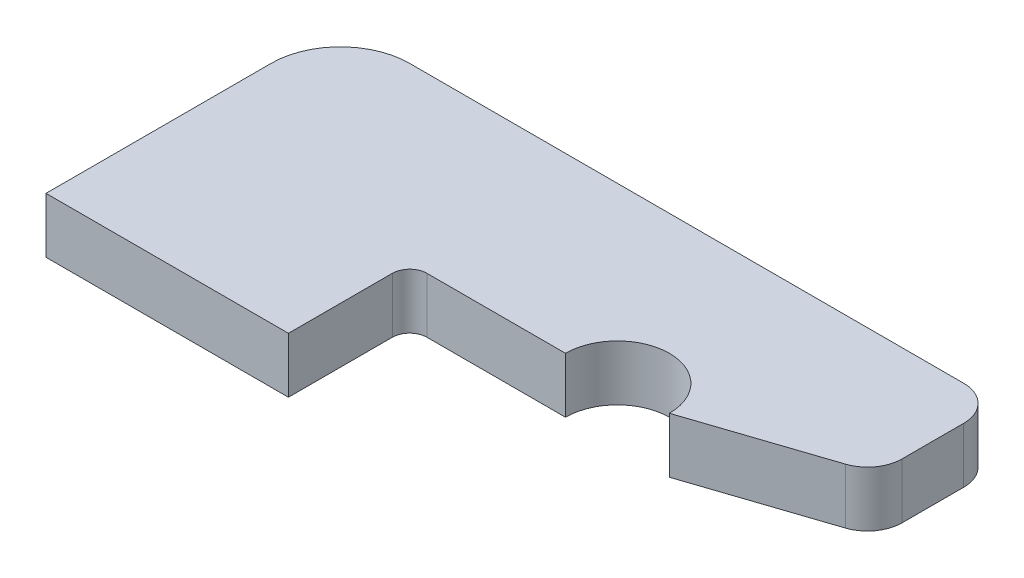
ISO-10303-21;
HEADER;
FILE_DESCRIPTION(('STEP AP214'),'2;1');
FILE_NAME('part.step','',(''),(''),'','','');
FILE_SCHEMA(('AUTOMOTIVE_DESIGN { 1 0 10303 214 1 1 1 1 }'));
ENDSEC;
DATA;
#1=APPLICATION_CONTEXT('core data for automotive mechanical design processes');
#2=APPLICATION_PROTOCOL_DEFINITION('international standard','automotive_design',2000,#1);
#3=PRODUCT_CONTEXT('',#1,'mechanical');
#4=PRODUCT('Part','Part','',(#3));
#5=PRODUCT_RELATED_PRODUCT_CATEGORY('part','',(#4));
#6=PRODUCT_DEFINITION_FORMATION('','',#4);
#7=PRODUCT_DEFINITION_CONTEXT('part definition',#1,'design');
#8=PRODUCT_DEFINITION('design','',#6,#7);
#9=PRODUCT_DEFINITION_SHAPE('','',#8);
#10=(LENGTH_UNIT() NAMED_UNIT(*) SI_UNIT(.MILLI.,.METRE.));
#11=(NAMED_UNIT(*) PLANE_ANGLE_UNIT() SI_UNIT($,.RADIAN.));
#12=(NAMED_UNIT(*) SI_UNIT($,.STERADIAN.) SOLID_ANGLE_UNIT());
#13=UNCERTAINTY_MEASURE_WITH_UNIT(LENGTH_MEASURE(1.E-05),#10,'distance_accuracy_value','');
#14=(GEOMETRIC_REPRESENTATION_CONTEXT(3) GLOBAL_UNCERTAINTY_ASSIGNED_CONTEXT((#13)) GLOBAL_UNIT_ASSIGNED_CONTEXT((#10,
#11,#12)) REPRESENTATION_CONTEXT('',''));
#15=CARTESIAN_POINT('',(0.,0.,0.));
#16=DIRECTION('',(0.,0.,1.));
#17=DIRECTION('',(1.,0.,0.));
#18=AXIS2_PLACEMENT_3D('',#15,#16,#17);
#19=CARTESIAN_POINT('',(4.,1.6,1.25));
#20=DIRECTION('',(0.,1.,0.));
#21=DIRECTION('',(0.,0.,1.));
#22=AXIS2_PLACEMENT_3D('',#19,#20,#21);
#23=CYLINDRICAL_SURFACE('',#22,0.5);
#24=DIRECTION('',(0.,-1.,0.));
#25=VECTOR('',#24,1.);
#26=CARTESIAN_POINT('',(4.,1.6,0.749999999999999));
#27=LINE('',#26,#25);
#28=CARTESIAN_POINT('',(4.,1.6,0.749999999999999));
#29=VERTEX_POINT('',#28);
#30=CARTESIAN_POINT('',(4.,0.,0.749999999999999));
#31=VERTEX_POINT('',#30);
#32=EDGE_CURVE('E214',#29,#31,#27,.T.);
#33=ORIENTED_EDGE('',*,*,#32,.F.);
#34=CARTESIAN_POINT('',(4.,1.6,1.25));
#35=DIRECTION('',(0.,1.,0.));
#36=DIRECTION('',(0.,0.,1.));
#37=AXIS2_PLACEMENT_3D('',#34,#35,#36);
#38=CIRCLE('',#37,0.5);
#39=CARTESIAN_POINT('',(3.5,1.6,1.25));
#40=VERTEX_POINT('',#39);
#41=EDGE_CURVE('E43',#29,#40,#38,.T.);
#42=ORIENTED_EDGE('',*,*,#41,.T.);
#43=DIRECTION('',(0.,-1.,0.));
#44=VECTOR('',#43,1.);
#45=CARTESIAN_POINT('',(3.5,1.6,1.25));
#46=LINE('',#45,#44);
#47=CARTESIAN_POINT('',(3.5,0.,1.25));
#48=VERTEX_POINT('',#47);
#49=EDGE_CURVE('E217',#48,#40,#46,.F.);
#50=ORIENTED_EDGE('',*,*,#49,.F.);
#51=CARTESIAN_POINT('',(4.,0.,1.25));
#52=DIRECTION('',(0.,1.,0.));
#53=DIRECTION('',(0.,0.,1.));
#54=AXIS2_PLACEMENT_3D('',#51,#52,#53);
#55=CIRCLE('',#54,0.5);
#56=EDGE_CURVE('E11',#48,#31,#55,.F.);
#57=ORIENTED_EDGE('',*,*,#56,.T.);
#58=EDGE_LOOP('',(#33,#42,#50,#57));
#59=FACE_BOUND('',#58,.T.);
#60=ADVANCED_FACE('F36',(#59),#23,.F.);
#61=CARTESIAN_POINT('',(14.5,1.6,-3.25));
#62=DIRECTION('',(0.,-1.,0.));
#63=DIRECTION('',(0.,0.,-1.));
#64=AXIS2_PLACEMENT_3D('',#61,#62,#63);
#65=CYLINDRICAL_SURFACE('',#64,1.);
#66=DIRECTION('',(0.,-1.,0.));
#67=VECTOR('',#66,1.);
#68=CARTESIAN_POINT('',(14.5,1.6,-4.25));
#69=LINE('',#68,#67);
#70=CARTESIAN_POINT('',(14.5,1.6,-4.25));
#71=VERTEX_POINT('',#70);
#72=CARTESIAN_POINT('',(14.5,0.,-4.25));
#73=VERTEX_POINT('',#72);
#74=EDGE_CURVE('E204',#71,#73,#69,.T.);
#75=ORIENTED_EDGE('',*,*,#74,.F.);
#76=CARTESIAN_POINT('',(14.5,1.6,-3.25));
#77=DIRECTION('',(0.,1.,0.));
#78=DIRECTION('',(0.,0.,1.));
#79=AXIS2_PLACEMENT_3D('',#76,#77,#78);
#80=CIRCLE('',#79,1.);
#81=CARTESIAN_POINT('',(15.5,1.6,-3.25));
#82=VERTEX_POINT('',#81);
#83=EDGE_CURVE('E210',#82,#71,#80,.T.);
#84=ORIENTED_EDGE('',*,*,#83,.F.);
#85=DIRECTION('',(0.,-1.,0.));
#86=VECTOR('',#85,1.);
#87=CARTESIAN_POINT('',(15.5,1.6,-3.25));
#88=LINE('',#87,#86);
#89=CARTESIAN_POINT('',(15.5,0.,-3.25));
#90=VERTEX_POINT('',#89);
#91=EDGE_CURVE('E207',#90,#82,#88,.F.);
#92=ORIENTED_EDGE('',*,*,#91,.F.);
#93=CARTESIAN_POINT('',(14.5,0.,-3.25));
#94=DIRECTION('',(0.,1.,0.));
#95=DIRECTION('',(0.,0.,1.));
#96=AXIS2_PLACEMENT_3D('',#93,#94,#95);
#97=CIRCLE('',#96,1.);
#98=EDGE_CURVE('E212',#73,#90,#97,.F.);
#99=ORIENTED_EDGE('',*,*,#98,.F.);
#100=EDGE_LOOP('',(#75,#84,#92,#99));
#101=FACE_BOUND('',#100,.T.);
#102=ADVANCED_FACE('F243',(#101),#65,.T.);
#103=CARTESIAN_POINT('',(14.5,1.6,-1.47075922005613));
#104=DIRECTION('',(0.,1.,0.));
#105=DIRECTION('',(0.,0.,1.));
#106=AXIS2_PLACEMENT_3D('',#103,#104,#105);
#107=CYLINDRICAL_SURFACE('',#106,1.);
#108=DIRECTION('',(0.,-1.,0.));
#109=VECTOR('',#108,1.);
#110=CARTESIAN_POINT('',(15.5,1.6,-1.47075922005613));
#111=LINE('',#110,#109);
#112=CARTESIAN_POINT('',(15.5,1.6,-1.47075922005613));
#113=VERTEX_POINT('',#112);
#114=CARTESIAN_POINT('',(15.5,0.,-1.47075922005613));
#115=VERTEX_POINT('',#114);
#116=EDGE_CURVE('E195',#113,#115,#111,.T.);
#117=ORIENTED_EDGE('',*,*,#116,.F.);
#118=CARTESIAN_POINT('',(14.5,1.6,-1.47075922005613));
#119=DIRECTION('',(0.,1.,0.));
#120=DIRECTION('',(0.,0.,1.));
#121=AXIS2_PLACEMENT_3D('',#118,#119,#120);
#122=CIRCLE('',#121,1.);
#123=CARTESIAN_POINT('',(14.8162277660168,1.6,-0.522075922005613));
#124=VERTEX_POINT('',#123);
#125=EDGE_CURVE('E200',#124,#113,#122,.T.);
#126=ORIENTED_EDGE('',*,*,#125,.F.);
#127=DIRECTION('',(0.,-1.,0.));
#128=VECTOR('',#127,1.);
#129=CARTESIAN_POINT('',(14.8162277660168,1.6,-0.522075922005613));
#130=LINE('',#129,#128);
#131=CARTESIAN_POINT('',(14.8162277660168,0.,-0.522075922005613));
#132=VERTEX_POINT('',#131);
#133=EDGE_CURVE('E198',#132,#124,#130,.F.);
#134=ORIENTED_EDGE('',*,*,#133,.F.);
#135=CARTESIAN_POINT('',(14.5,0.,-1.47075922005613));
#136=DIRECTION('',(0.,1.,0.));
#137=DIRECTION('',(0.,0.,1.));
#138=AXIS2_PLACEMENT_3D('',#135,#136,#137);
#139=CIRCLE('',#138,1.);
#140=EDGE_CURVE('E128',#115,#132,#139,.F.);
#141=ORIENTED_EDGE('',*,*,#140,.F.);
#142=EDGE_LOOP('',(#117,#126,#134,#141));
#143=FACE_BOUND('',#142,.T.);
#144=ADVANCED_FACE('F249',(#143),#107,.T.);
#145=CARTESIAN_POINT('',(0.,1.6,0.749999999999999));
#146=DIRECTION('',(0.,0.,-1.));
#147=DIRECTION('',(-1.,0.,0.));
#148=AXIS2_PLACEMENT_3D('',#145,#146,#147);
#149=PLANE('',#148);
#150=DIRECTION('',(1.,0.,0.));
#151=VECTOR('',#150,1.);
#152=CARTESIAN_POINT('',(0.,1.6,0.749999999999999));
#153=LINE('',#152,#151);
#154=CARTESIAN_POINT('',(8.,1.6,0.749999999999999));
#155=VERTEX_POINT('',#154);
#156=EDGE_CURVE('E167',#29,#155,#153,.T.);
#157=ORIENTED_EDGE('',*,*,#156,.F.);
#158=ORIENTED_EDGE('',*,*,#32,.T.);
#159=DIRECTION('',(1.,0.,0.));
#160=VECTOR('',#159,1.);
#161=CARTESIAN_POINT('',(0.,0.,0.749999999999999));
#162=LINE('',#161,#160);
#163=CARTESIAN_POINT('',(8.,0.,0.749999999999999));
#164=VERTEX_POINT('',#163);
#165=EDGE_CURVE('E184',#31,#164,#162,.T.);
#166=ORIENTED_EDGE('',*,*,#165,.T.);
#167=DIRECTION('',(0.,1.,0.));
#168=VECTOR('',#167,1.);
#169=CARTESIAN_POINT('',(8.,0.,0.749999999999999));
#170=LINE('',#169,#168);
#171=EDGE_CURVE('E142',#164,#155,#170,.T.);
#172=ORIENTED_EDGE('',*,*,#171,.T.);
#173=EDGE_LOOP('',(#157,#158,#166,#172));
#174=FACE_BOUND('',#173,.T.);
#175=ADVANCED_FACE('F254',(#174),#149,.F.);
#176=CARTESIAN_POINT('',(0.,1.6,-4.25));
#177=DIRECTION('',(0.,0.,-1.));
#178=DIRECTION('',(-1.,0.,0.));
#179=AXIS2_PLACEMENT_3D('',#176,#177,#178);
#180=PLANE('',#179);
#181=DIRECTION('',(1.,0.,0.));
#182=VECTOR('',#181,1.);
#183=CARTESIAN_POINT('',(0.,1.6,-4.25));
#184=LINE('',#183,#182);
#185=CARTESIAN_POINT('',(-1.49999999999999,1.6,-4.25));
#186=VERTEX_POINT('',#185);
#187=EDGE_CURVE('E153',#186,#71,#184,.T.);
#188=ORIENTED_EDGE('',*,*,#187,.T.);
#189=ORIENTED_EDGE('',*,*,#74,.T.);
#190=DIRECTION('',(1.,0.,0.));
#191=VECTOR('',#190,1.);
#192=CARTESIAN_POINT('',(0.,0.,-4.25));
#193=LINE('',#192,#191);
#194=CARTESIAN_POINT('',(-1.49999999999999,0.,-4.25));
#195=VERTEX_POINT('',#194);
#196=EDGE_CURVE('E152',#195,#73,#193,.T.);
#197=ORIENTED_EDGE('',*,*,#196,.F.);
#198=DIRECTION('',(0.,-1.,0.));
#199=VECTOR('',#198,1.);
#200=CARTESIAN_POINT('',(-1.49999999999999,1.6,-4.25));
#201=LINE('',#200,#199);
#202=EDGE_CURVE('E193',#186,#195,#201,.T.);
#203=ORIENTED_EDGE('',*,*,#202,.F.);
#204=EDGE_LOOP('',(#188,#189,#197,#203));
#205=FACE_BOUND('',#204,.T.);
#206=ADVANCED_FACE('F239',(#205),#180,.T.);
#207=CARTESIAN_POINT('',(-1.5,1.6,-2.25));
#208=DIRECTION('',(0.,-1.,0.));
#209=DIRECTION('',(0.,0.,-1.));
#210=AXIS2_PLACEMENT_3D('',#207,#208,#209);
#211=CYLINDRICAL_SURFACE('',#210,2.);
#212=CARTESIAN_POINT('',(-1.5,0.,-2.25));
#213=DIRECTION('',(0.,1.,0.));
#214=DIRECTION('',(0.,0.,1.));
#215=AXIS2_PLACEMENT_3D('',#212,#213,#214);
#216=CIRCLE('',#215,2.);
#217=CARTESIAN_POINT('',(-3.5,0.,-2.24999999999999));
#218=VERTEX_POINT('',#217);
#219=EDGE_CURVE('E173',#195,#218,#216,.T.);
#220=ORIENTED_EDGE('',*,*,#219,.T.);
#221=DIRECTION('',(0.,-1.,0.));
#222=VECTOR('',#221,1.);
#223=CARTESIAN_POINT('',(-3.5,1.6,-2.24999999999999));
#224=LINE('',#223,#222);
#225=CARTESIAN_POINT('',(-3.5,1.6,-2.24999999999999));
#226=VERTEX_POINT('',#225);
#227=EDGE_CURVE('E191',#226,#218,#224,.T.);
#228=ORIENTED_EDGE('',*,*,#227,.F.);
#229=CARTESIAN_POINT('',(-1.5,1.6,-2.25));
#230=DIRECTION('',(0.,1.,0.));
#231=DIRECTION('',(0.,0.,1.));
#232=AXIS2_PLACEMENT_3D('',#229,#230,#231);
#233=CIRCLE('',#232,2.);
#234=EDGE_CURVE('E156',#186,#226,#233,.T.);
#235=ORIENTED_EDGE('',*,*,#234,.F.);
#236=ORIENTED_EDGE('',*,*,#202,.T.);
#237=EDGE_LOOP('',(#220,#228,#235,#236));
#238=FACE_BOUND('',#237,.T.);
#239=ADVANCED_FACE('F236',(#238),#211,.T.);
#240=CARTESIAN_POINT('',(-3.5,1.6,0.));
#241=DIRECTION('',(-1.,0.,0.));
#242=DIRECTION('',(0.,0.,1.));
#243=AXIS2_PLACEMENT_3D('',#240,#241,#242);
#244=PLANE('',#243);
#245=DIRECTION('',(0.,0.,-1.));
#246=VECTOR('',#245,1.);
#247=CARTESIAN_POINT('',(-3.5,0.,0.));
#248=LINE('',#247,#246);
#249=CARTESIAN_POINT('',(-3.5,0.,4.25));
#250=VERTEX_POINT('',#249);
#251=EDGE_CURVE('E176',#250,#218,#248,.T.);
#252=ORIENTED_EDGE('',*,*,#251,.F.);
#253=DIRECTION('',(0.,-1.,0.));
#254=VECTOR('',#253,1.);
#255=CARTESIAN_POINT('',(-3.5,1.6,4.25));
#256=LINE('',#255,#254);
#257=CARTESIAN_POINT('',(-3.5,1.6,4.25));
#258=VERTEX_POINT('',#257);
#259=EDGE_CURVE('E189',#258,#250,#256,.T.);
#260=ORIENTED_EDGE('',*,*,#259,.F.);
#261=DIRECTION('',(0.,0.,-1.));
#262=VECTOR('',#261,1.);
#263=CARTESIAN_POINT('',(-3.5,1.6,0.));
#264=LINE('',#263,#262);
#265=EDGE_CURVE('E159',#258,#226,#264,.T.);
#266=ORIENTED_EDGE('',*,*,#265,.T.);
#267=ORIENTED_EDGE('',*,*,#227,.T.);
#268=EDGE_LOOP('',(#252,#260,#266,#267));
#269=FACE_BOUND('',#268,.T.);
#270=ADVANCED_FACE('F232',(#269),#244,.T.);
#271=CARTESIAN_POINT('',(0.,1.6,4.25));
#272=DIRECTION('',(0.,0.,-1.));
#273=DIRECTION('',(-1.,0.,0.));
#274=AXIS2_PLACEMENT_3D('',#271,#272,#273);
#275=PLANE('',#274);
#276=DIRECTION('',(1.,0.,0.));
#277=VECTOR('',#276,1.);
#278=CARTESIAN_POINT('',(0.,0.,4.25));
#279=LINE('',#278,#277);
#280=CARTESIAN_POINT('',(3.5,0.,4.25));
#281=VERTEX_POINT('',#280);
#282=EDGE_CURVE('E179',#250,#281,#279,.T.);
#283=ORIENTED_EDGE('',*,*,#282,.T.);
#284=DIRECTION('',(0.,-1.,0.));
#285=VECTOR('',#284,1.);
#286=CARTESIAN_POINT('',(3.5,1.6,4.25));
#287=LINE('',#286,#285);
#288=CARTESIAN_POINT('',(3.5,1.6,4.25));
#289=VERTEX_POINT('',#288);
#290=EDGE_CURVE('E171',#289,#281,#287,.T.);
#291=ORIENTED_EDGE('',*,*,#290,.F.);
#292=DIRECTION('',(1.,0.,0.));
#293=VECTOR('',#292,1.);
#294=CARTESIAN_POINT('',(0.,1.6,4.25));
#295=LINE('',#294,#293);
#296=EDGE_CURVE('E162',#258,#289,#295,.T.);
#297=ORIENTED_EDGE('',*,*,#296,.F.);
#298=ORIENTED_EDGE('',*,*,#259,.T.);
#299=EDGE_LOOP('',(#283,#291,#297,#298));
#300=FACE_BOUND('',#299,.T.);
#301=ADVANCED_FACE('F227',(#300),#275,.F.);
#302=CARTESIAN_POINT('',(3.5,1.6,0.));
#303=DIRECTION('',(-1.,0.,0.));
#304=DIRECTION('',(0.,0.,1.));
#305=AXIS2_PLACEMENT_3D('',#302,#303,#304);
#306=PLANE('',#305);
#307=DIRECTION('',(0.,0.,-1.));
#308=VECTOR('',#307,1.);
#309=CARTESIAN_POINT('',(3.5,0.,0.));
#310=LINE('',#309,#308);
#311=EDGE_CURVE('E181',#281,#48,#310,.T.);
#312=ORIENTED_EDGE('',*,*,#311,.T.);
#313=ORIENTED_EDGE('',*,*,#49,.T.);
#314=DIRECTION('',(0.,0.,-1.));
#315=VECTOR('',#314,1.);
#316=CARTESIAN_POINT('',(3.5,1.6,0.));
#317=LINE('',#316,#315);
#318=EDGE_CURVE('E164',#289,#40,#317,.T.);
#319=ORIENTED_EDGE('',*,*,#318,.F.);
#320=ORIENTED_EDGE('',*,*,#290,.T.);
#321=EDGE_LOOP('',(#312,#313,#319,#320));
#322=FACE_BOUND('',#321,.T.);
#323=ADVANCED_FACE('F220',(#322),#306,.F.);
#324=CARTESIAN_POINT('',(15.5,1.6,0.));
#325=DIRECTION('',(1.,0.,0.));
#326=DIRECTION('',(0.,0.,-1.));
#327=AXIS2_PLACEMENT_3D('',#324,#325,#326);
#328=PLANE('',#327);
#329=DIRECTION('',(0.,0.,1.));
#330=VECTOR('',#329,1.);
#331=CARTESIAN_POINT('',(15.5,0.,0.));
#332=LINE('',#331,#330);
#333=EDGE_CURVE('E157',#90,#115,#332,.T.);
#334=ORIENTED_EDGE('',*,*,#333,.F.);
#335=ORIENTED_EDGE('',*,*,#91,.T.);
#336=DIRECTION('',(0.,0.,1.));
#337=VECTOR('',#336,1.);
#338=CARTESIAN_POINT('',(15.5,1.6,0.));
#339=LINE('',#338,#337);
#340=EDGE_CURVE('E169',#82,#113,#339,.T.);
#341=ORIENTED_EDGE('',*,*,#340,.T.);
#342=ORIENTED_EDGE('',*,*,#116,.T.);
#343=EDGE_LOOP('',(#334,#335,#341,#342));
#344=FACE_BOUND('',#343,.T.);
#345=ADVANCED_FACE('F250',(#344),#328,.T.);
#346=CARTESIAN_POINT('',(0.,1.6,0.));
#347=DIRECTION('',(0.,1.,0.));
#348=DIRECTION('',(0.,0.,1.));
#349=AXIS2_PLACEMENT_3D('',#346,#347,#348);
#350=PLANE('',#349);
#351=ORIENTED_EDGE('',*,*,#41,.F.);
#352=ORIENTED_EDGE('',*,*,#156,.T.);
#353=CARTESIAN_POINT('',(9.5,1.6,0.749999999999999));
#354=DIRECTION('',(0.,1.,0.));
#355=DIRECTION('',(0.,0.,1.));
#356=AXIS2_PLACEMENT_3D('',#353,#354,#355);
#357=CIRCLE('',#356,1.5);
#358=CARTESIAN_POINT('',(11.,1.6,0.749999999999999));
#359=VERTEX_POINT('',#358);
#360=EDGE_CURVE('E132',#359,#155,#357,.T.);
#361=ORIENTED_EDGE('',*,*,#360,.F.);
#362=DIRECTION('',(-0.948683298050514,0.,0.316227766016838));
#363=VECTOR('',#362,1.);
#364=CARTESIAN_POINT('',(11.,1.6,0.749999999999999));
#365=LINE('',#364,#363);
#366=EDGE_CURVE('E133',#124,#359,#365,.T.);
#367=ORIENTED_EDGE('',*,*,#366,.F.);
#368=ORIENTED_EDGE('',*,*,#125,.T.);
#369=ORIENTED_EDGE('',*,*,#340,.F.);
#370=ORIENTED_EDGE('',*,*,#83,.T.);
#371=ORIENTED_EDGE('',*,*,#187,.F.);
#372=ORIENTED_EDGE('',*,*,#234,.T.);
#373=ORIENTED_EDGE('',*,*,#265,.F.);
#374=ORIENTED_EDGE('',*,*,#296,.T.);
#375=ORIENTED_EDGE('',*,*,#318,.T.);
#376=EDGE_LOOP('',(#351,#352,#361,#367,#368,#369,#370,#371,#372,#373,#374,#375));
#377=FACE_BOUND('',#376,.T.);
#378=ADVANCED_FACE('F222',(#377),#350,.T.);
#379=CARTESIAN_POINT('',(0.,0.,0.));
#380=DIRECTION('',(0.,1.,0.));
#381=DIRECTION('',(0.,0.,1.));
#382=AXIS2_PLACEMENT_3D('',#379,#380,#381);
#383=PLANE('',#382);
#384=ORIENTED_EDGE('',*,*,#196,.T.);
#385=ORIENTED_EDGE('',*,*,#98,.T.);
#386=ORIENTED_EDGE('',*,*,#333,.T.);
#387=ORIENTED_EDGE('',*,*,#140,.T.);
#388=DIRECTION('',(-0.948683298050514,0.,0.316227766016838));
#389=VECTOR('',#388,1.);
#390=CARTESIAN_POINT('',(11.,0.,0.749999999999999));
#391=LINE('',#390,#389);
#392=CARTESIAN_POINT('',(11.,0.,0.749999999999999));
#393=VERTEX_POINT('',#392);
#394=EDGE_CURVE('E121',#132,#393,#391,.T.);
#395=ORIENTED_EDGE('',*,*,#394,.T.);
#396=CARTESIAN_POINT('',(9.5,0.,0.749999999999999));
#397=DIRECTION('',(0.,1.,0.));
#398=DIRECTION('',(0.,0.,1.));
#399=AXIS2_PLACEMENT_3D('',#396,#397,#398);
#400=CIRCLE('',#399,1.5);
#401=EDGE_CURVE('E126',#393,#164,#400,.T.);
#402=ORIENTED_EDGE('',*,*,#401,.T.);
#403=ORIENTED_EDGE('',*,*,#165,.F.);
#404=ORIENTED_EDGE('',*,*,#56,.F.);
#405=ORIENTED_EDGE('',*,*,#311,.F.);
#406=ORIENTED_EDGE('',*,*,#282,.F.);
#407=ORIENTED_EDGE('',*,*,#251,.T.);
#408=ORIENTED_EDGE('',*,*,#219,.F.);
#409=EDGE_LOOP('',(#384,#385,#386,#387,#395,#402,#403,#404,#405,#406,#407,#408));
#410=FACE_BOUND('',#409,.T.);
#411=ADVANCED_FACE('F124',(#410),#383,.F.);
#412=CARTESIAN_POINT('',(9.5,0.,0.749999999999999));
#413=DIRECTION('',(0.,1.,0.));
#414=DIRECTION('',(0.,0.,1.));
#415=AXIS2_PLACEMENT_3D('',#412,#413,#414);
#416=CYLINDRICAL_SURFACE('',#415,1.5);
#417=ORIENTED_EDGE('',*,*,#401,.F.);
#418=DIRECTION('',(0.,1.,0.));
#419=VECTOR('',#418,1.);
#420=CARTESIAN_POINT('',(11.,0.,0.749999999999999));
#421=LINE('',#420,#419);
#422=EDGE_CURVE('E136',#359,#393,#421,.F.);
#423=ORIENTED_EDGE('',*,*,#422,.F.);
#424=ORIENTED_EDGE('',*,*,#360,.T.);
#425=ORIENTED_EDGE('',*,*,#171,.F.);
#426=EDGE_LOOP('',(#417,#423,#424,#425));
#427=FACE_BOUND('',#426,.T.);
#428=ADVANCED_FACE('F145',(#427),#416,.F.);
#429=CARTESIAN_POINT('',(11.,0.,0.749999999999999));
#430=DIRECTION('',(-0.316227766016838,0.,-0.948683298050514));
#431=DIRECTION('',(-0.948683298050514,0.,0.316227766016838));
#432=AXIS2_PLACEMENT_3D('',#429,#430,#431);
#433=PLANE('',#432);
#434=ORIENTED_EDGE('',*,*,#394,.F.);
#435=ORIENTED_EDGE('',*,*,#133,.T.);
#436=ORIENTED_EDGE('',*,*,#366,.T.);
#437=ORIENTED_EDGE('',*,*,#422,.T.);
#438=EDGE_LOOP('',(#434,#435,#436,#437));
#439=FACE_BOUND('',#438,.T.);
#440=ADVANCED_FACE('F137',(#439),#433,.F.);
#441=CLOSED_SHELL('',(#60,#102,#144,#175,#206,#239,#270,#301,#323,#345,#378,#411,#428,#440));
#442=MANIFOLD_SOLID_BREP('B2',#441);
#443=ADVANCED_BREP_SHAPE_REPRESENTATION('',(#18,#442),#14);
#444=SHAPE_DEFINITION_REPRESENTATION(#9,#443);
ENDSEC;
END-ISO-10303-21;
